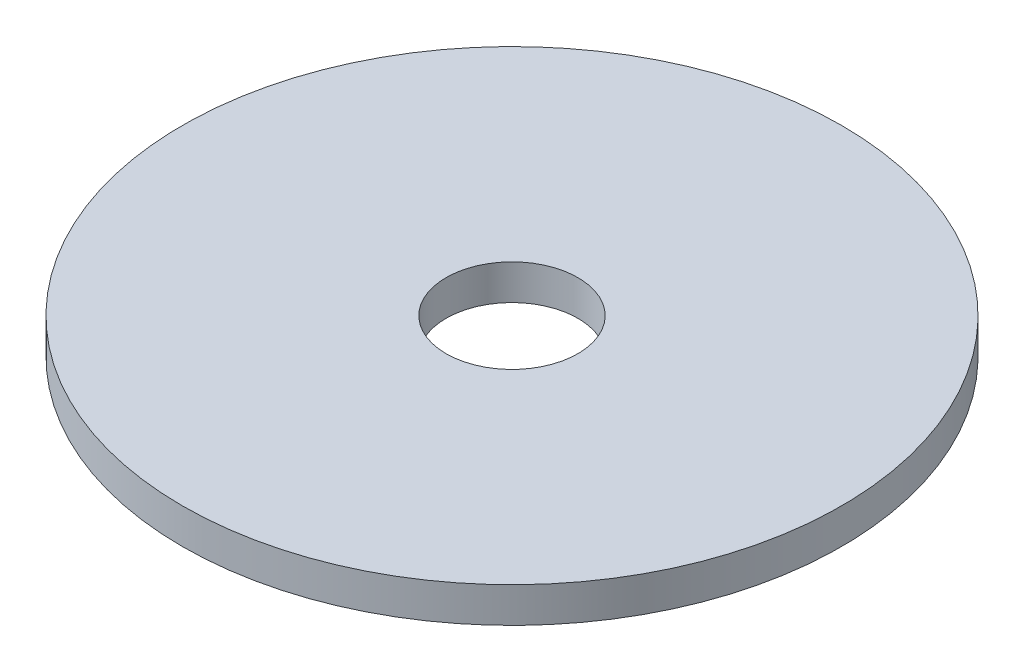
ISO-10303-21;
HEADER;
FILE_DESCRIPTION(('STEP AP214'),'2;1');
FILE_NAME('part.step','',(''),(''),'','','');
FILE_SCHEMA(('AUTOMOTIVE_DESIGN { 1 0 10303 214 1 1 1 1 }'));
ENDSEC;
DATA;
#1=APPLICATION_CONTEXT('core data for automotive mechanical design processes');
#2=APPLICATION_PROTOCOL_DEFINITION('international standard','automotive_design',2000,#1);
#3=PRODUCT_CONTEXT('',#1,'mechanical');
#4=PRODUCT('Part','Part','',(#3));
#5=PRODUCT_RELATED_PRODUCT_CATEGORY('part','',(#4));
#6=PRODUCT_DEFINITION_FORMATION('','',#4);
#7=PRODUCT_DEFINITION_CONTEXT('part definition',#1,'design');
#8=PRODUCT_DEFINITION('design','',#6,#7);
#9=PRODUCT_DEFINITION_SHAPE('','',#8);
#10=(LENGTH_UNIT() NAMED_UNIT(*) SI_UNIT(.MILLI.,.METRE.));
#11=(NAMED_UNIT(*) PLANE_ANGLE_UNIT() SI_UNIT($,.RADIAN.));
#12=(NAMED_UNIT(*) SI_UNIT($,.STERADIAN.) SOLID_ANGLE_UNIT());
#13=UNCERTAINTY_MEASURE_WITH_UNIT(LENGTH_MEASURE(1.E-05),#10,'distance_accuracy_value','');
#14=(GEOMETRIC_REPRESENTATION_CONTEXT(3) GLOBAL_UNCERTAINTY_ASSIGNED_CONTEXT((#13)) GLOBAL_UNIT_ASSIGNED_CONTEXT((#10,
#11,#12)) REPRESENTATION_CONTEXT('',''));
#15=CARTESIAN_POINT('',(0.,0.,0.));
#16=DIRECTION('',(0.,0.,1.));
#17=DIRECTION('',(1.,0.,0.));
#18=AXIS2_PLACEMENT_3D('',#15,#16,#17);
#19=CARTESIAN_POINT('',(0.,21.8605952792887,0.));
#20=DIRECTION('',(0.,1.,0.));
#21=DIRECTION('',(0.,0.,1.));
#22=AXIS2_PLACEMENT_3D('',#19,#20,#21);
#23=CYLINDRICAL_SURFACE('',#22,6.);
#24=CARTESIAN_POINT('',(0.,1.60545976070479,0.));
#25=DIRECTION('',(0.,1.,0.));
#26=DIRECTION('',(0.,0.,1.));
#27=AXIS2_PLACEMENT_3D('',#24,#25,#26);
#28=CIRCLE('',#27,6.);
#29=CARTESIAN_POINT('',(0.,1.60545976070479,6.));
#30=VERTEX_POINT('',#29);
#31=EDGE_CURVE('E10',#30,#30,#28,.T.);
#32=ORIENTED_EDGE('',*,*,#31,.T.);
#33=EDGE_LOOP('',(#32));
#34=FACE_BOUND('',#33,.T.);
#35=CARTESIAN_POINT('',(0.,-1.60545976070479,0.));
#36=DIRECTION('',(0.,1.,0.));
#37=DIRECTION('',(0.,0.,1.));
#38=AXIS2_PLACEMENT_3D('',#35,#36,#37);
#39=CIRCLE('',#38,6.);
#40=CARTESIAN_POINT('',(0.,-1.60545976070479,6.));
#41=VERTEX_POINT('',#40);
#42=EDGE_CURVE('E48',#41,#41,#39,.T.);
#43=ORIENTED_EDGE('',*,*,#42,.F.);
#44=EDGE_LOOP('',(#43));
#45=FACE_BOUND('',#44,.T.);
#46=ADVANCED_FACE('F34',(#34,#45),#23,.F.);
#47=CARTESIAN_POINT('',(0.,1.60545976070479,30.));
#48=DIRECTION('',(0.,1.,0.));
#49=DIRECTION('',(0.,0.,1.));
#50=AXIS2_PLACEMENT_3D('',#47,#48,#49);
#51=PLANE('',#50);
#52=CARTESIAN_POINT('',(0.,1.60545976070479,0.));
#53=DIRECTION('',(0.,1.,0.));
#54=DIRECTION('',(0.,0.,1.));
#55=AXIS2_PLACEMENT_3D('',#52,#53,#54);
#56=CIRCLE('',#55,30.);
#57=CARTESIAN_POINT('',(0.,1.60545976070479,30.));
#58=VERTEX_POINT('',#57);
#59=EDGE_CURVE('E40',#58,#58,#56,.T.);
#60=ORIENTED_EDGE('',*,*,#59,.T.);
#61=EDGE_LOOP('',(#60));
#62=FACE_BOUND('',#61,.T.);
#63=ORIENTED_EDGE('',*,*,#31,.F.);
#64=EDGE_LOOP('',(#63));
#65=FACE_BOUND('',#64,.T.);
#66=ADVANCED_FACE('F58',(#62,#65),#51,.T.);
#67=CARTESIAN_POINT('',(0.,21.8605952792887,0.));
#68=DIRECTION('',(0.,1.,0.));
#69=DIRECTION('',(0.,0.,1.));
#70=AXIS2_PLACEMENT_3D('',#67,#68,#69);
#71=CYLINDRICAL_SURFACE('',#70,30.);
#72=CARTESIAN_POINT('',(0.,-1.60545976070479,0.));
#73=DIRECTION('',(0.,1.,0.));
#74=DIRECTION('',(0.,0.,1.));
#75=AXIS2_PLACEMENT_3D('',#72,#73,#74);
#76=CIRCLE('',#75,30.);
#77=CARTESIAN_POINT('',(0.,-1.60545976070479,30.));
#78=VERTEX_POINT('',#77);
#79=EDGE_CURVE('E44',#78,#78,#76,.T.);
#80=ORIENTED_EDGE('',*,*,#79,.T.);
#81=EDGE_LOOP('',(#80));
#82=FACE_BOUND('',#81,.T.);
#83=ORIENTED_EDGE('',*,*,#59,.F.);
#84=EDGE_LOOP('',(#83));
#85=FACE_BOUND('',#84,.T.);
#86=ADVANCED_FACE('F62',(#82,#85),#71,.T.);
#87=CARTESIAN_POINT('',(0.,-1.60545976070479,30.));
#88=DIRECTION('',(0.,-1.,0.));
#89=DIRECTION('',(0.,0.,-1.));
#90=AXIS2_PLACEMENT_3D('',#87,#88,#89);
#91=PLANE('',#90);
#92=ORIENTED_EDGE('',*,*,#42,.T.);
#93=EDGE_LOOP('',(#92));
#94=FACE_BOUND('',#93,.T.);
#95=ORIENTED_EDGE('',*,*,#79,.F.);
#96=EDGE_LOOP('',(#95));
#97=FACE_BOUND('',#96,.T.);
#98=ADVANCED_FACE('F54',(#94,#97),#91,.T.);
#99=CLOSED_SHELL('',(#46,#66,#86,#98));
#100=MANIFOLD_SOLID_BREP('B2',#99);
#101=ADVANCED_BREP_SHAPE_REPRESENTATION('',(#18,#100),#14);
#102=SHAPE_DEFINITION_REPRESENTATION(#9,#101);
ENDSEC;
END-ISO-10303-21;
